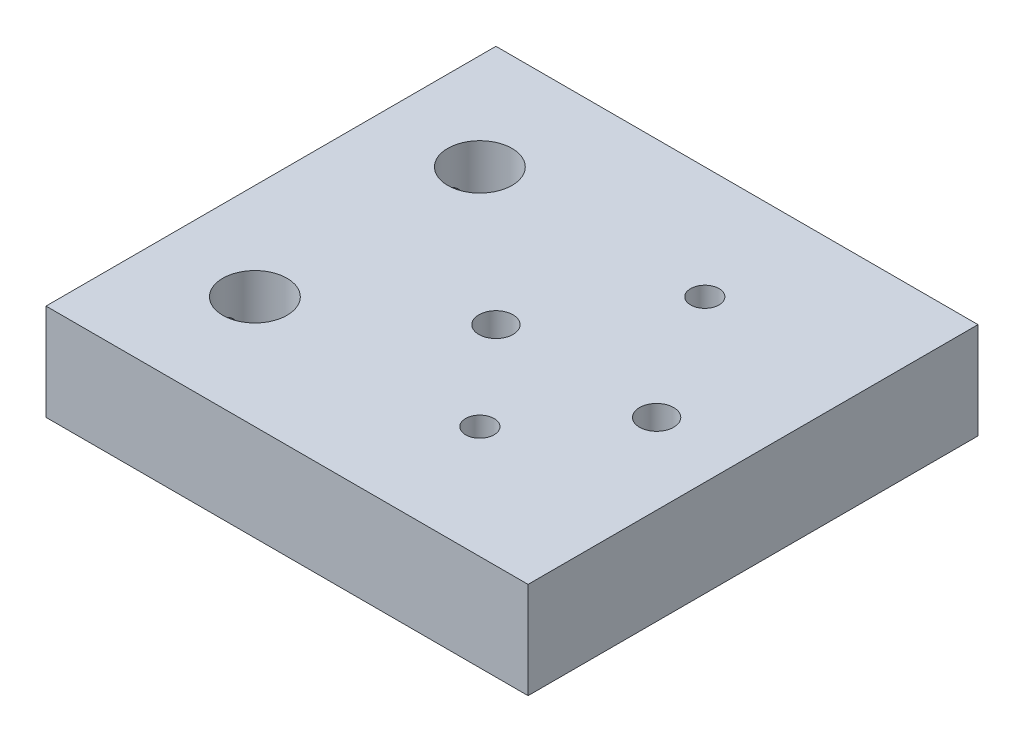
ISO-10303-21;
HEADER;
FILE_DESCRIPTION(('STEP AP214'),'2;1');
FILE_NAME('part.step','',(''),(''),'','','');
FILE_SCHEMA(('AUTOMOTIVE_DESIGN { 1 0 10303 214 1 1 1 1 }'));
ENDSEC;
DATA;
#1=APPLICATION_CONTEXT('core data for automotive mechanical design processes');
#2=APPLICATION_PROTOCOL_DEFINITION('international standard','automotive_design',2000,#1);
#3=PRODUCT_CONTEXT('',#1,'mechanical');
#4=PRODUCT('Part','Part','',(#3));
#5=PRODUCT_RELATED_PRODUCT_CATEGORY('part','',(#4));
#6=PRODUCT_DEFINITION_FORMATION('','',#4);
#7=PRODUCT_DEFINITION_CONTEXT('part definition',#1,'design');
#8=PRODUCT_DEFINITION('design','',#6,#7);
#9=PRODUCT_DEFINITION_SHAPE('','',#8);
#10=(LENGTH_UNIT() NAMED_UNIT(*) SI_UNIT(.MILLI.,.METRE.));
#11=(NAMED_UNIT(*) PLANE_ANGLE_UNIT() SI_UNIT($,.RADIAN.));
#12=(NAMED_UNIT(*) SI_UNIT($,.STERADIAN.) SOLID_ANGLE_UNIT());
#13=UNCERTAINTY_MEASURE_WITH_UNIT(LENGTH_MEASURE(1.E-05),#10,'distance_accuracy_value','');
#14=(GEOMETRIC_REPRESENTATION_CONTEXT(3) GLOBAL_UNCERTAINTY_ASSIGNED_CONTEXT((#13)) GLOBAL_UNIT_ASSIGNED_CONTEXT((#10,
#11,#12)) REPRESENTATION_CONTEXT('',''));
#15=CARTESIAN_POINT('',(0.,0.,0.));
#16=DIRECTION('',(0.,0.,1.));
#17=DIRECTION('',(1.,0.,0.));
#18=AXIS2_PLACEMENT_3D('',#15,#16,#17);
#19=CARTESIAN_POINT('',(0.,9.525,0.));
#20=DIRECTION('',(0.,-1.,0.));
#21=DIRECTION('',(0.,0.,-1.));
#22=AXIS2_PLACEMENT_3D('',#19,#20,#21);
#23=PLANE('',#22);
#24=CARTESIAN_POINT('',(0.,9.525,3.175));
#25=DIRECTION('',(0.,1.,0.));
#26=DIRECTION('',(0.,0.,1.));
#27=AXIS2_PLACEMENT_3D('',#24,#25,#26);
#28=CIRCLE('',#27,3.3782);
#29=CARTESIAN_POINT('',(0.,9.525,6.5532));
#30=VERTEX_POINT('',#29);
#31=EDGE_CURVE('E191',#30,#30,#28,.T.);
#32=ORIENTED_EDGE('',*,*,#31,.F.);
#33=EDGE_LOOP('',(#32));
#34=FACE_BOUND('',#33,.T.);
#35=CARTESIAN_POINT('',(15.875,9.525,-22.225));
#36=DIRECTION('',(0.,1.,0.));
#37=DIRECTION('',(0.,0.,1.));
#38=AXIS2_PLACEMENT_3D('',#35,#36,#37);
#39=CIRCLE('',#38,2.8067);
#40=CARTESIAN_POINT('',(15.875,9.525,-19.4183));
#41=VERTEX_POINT('',#40);
#42=EDGE_CURVE('E164',#41,#41,#39,.T.);
#43=ORIENTED_EDGE('',*,*,#42,.F.);
#44=EDGE_LOOP('',(#43));
#45=FACE_BOUND('',#44,.T.);
#46=CARTESIAN_POINT('',(15.875,9.525,22.225));
#47=DIRECTION('',(0.,1.,0.));
#48=DIRECTION('',(0.,0.,1.));
#49=AXIS2_PLACEMENT_3D('',#46,#47,#48);
#50=CIRCLE('',#49,2.8067);
#51=CARTESIAN_POINT('',(15.875,9.525,25.0317));
#52=VERTEX_POINT('',#51);
#53=EDGE_CURVE('E429',#52,#52,#50,.T.);
#54=ORIENTED_EDGE('',*,*,#53,.F.);
#55=EDGE_LOOP('',(#54));
#56=FACE_BOUND('',#55,.T.);
#57=CARTESIAN_POINT('',(-28.575,9.525,-22.225));
#58=DIRECTION('',(0.,1.,0.));
#59=DIRECTION('',(0.,0.,1.));
#60=AXIS2_PLACEMENT_3D('',#57,#58,#59);
#61=CIRCLE('',#60,6.35);
#62=CARTESIAN_POINT('',(-28.575,9.525,-15.875));
#63=VERTEX_POINT('',#62);
#64=EDGE_CURVE('E217',#63,#63,#61,.T.);
#65=ORIENTED_EDGE('',*,*,#64,.F.);
#66=EDGE_LOOP('',(#65));
#67=FACE_BOUND('',#66,.T.);
#68=CARTESIAN_POINT('',(-28.575,9.525,22.225));
#69=DIRECTION('',(0.,1.,0.));
#70=DIRECTION('',(0.,0.,1.));
#71=AXIS2_PLACEMENT_3D('',#68,#69,#70);
#72=CIRCLE('',#71,6.35);
#73=CARTESIAN_POINT('',(-28.575,9.525,28.575));
#74=VERTEX_POINT('',#73);
#75=EDGE_CURVE('E216',#74,#74,#72,.T.);
#76=ORIENTED_EDGE('',*,*,#75,.F.);
#77=EDGE_LOOP('',(#76));
#78=FACE_BOUND('',#77,.T.);
#79=DIRECTION('',(0.,0.,-1.));
#80=VECTOR('',#79,1.);
#81=CARTESIAN_POINT('',(-47.625,9.525,44.45));
#82=LINE('',#81,#80);
#83=CARTESIAN_POINT('',(-47.625,9.525,44.45));
#84=VERTEX_POINT('',#83);
#85=CARTESIAN_POINT('',(-47.625,9.525,-44.45));
#86=VERTEX_POINT('',#85);
#87=EDGE_CURVE('E115',#84,#86,#82,.T.);
#88=ORIENTED_EDGE('',*,*,#87,.F.);
#89=DIRECTION('',(1.,0.,0.));
#90=VECTOR('',#89,1.);
#91=CARTESIAN_POINT('',(-47.625,9.525,44.45));
#92=LINE('',#91,#90);
#93=CARTESIAN_POINT('',(47.625,9.525,44.45));
#94=VERTEX_POINT('',#93);
#95=EDGE_CURVE('E102',#84,#94,#92,.T.);
#96=ORIENTED_EDGE('',*,*,#95,.T.);
#97=DIRECTION('',(0.,0.,-1.));
#98=VECTOR('',#97,1.);
#99=CARTESIAN_POINT('',(47.625,9.525,44.45));
#100=LINE('',#99,#98);
#101=CARTESIAN_POINT('',(47.625,9.525,-44.45));
#102=VERTEX_POINT('',#101);
#103=EDGE_CURVE('E97',#94,#102,#100,.T.);
#104=ORIENTED_EDGE('',*,*,#103,.T.);
#105=DIRECTION('',(1.,0.,0.));
#106=VECTOR('',#105,1.);
#107=CARTESIAN_POINT('',(-47.625,9.525,-44.45));
#108=LINE('',#107,#106);
#109=EDGE_CURVE('E101',#86,#102,#108,.T.);
#110=ORIENTED_EDGE('',*,*,#109,.F.);
#111=EDGE_LOOP('',(#88,#96,#104,#110));
#112=FACE_BOUND('',#111,.T.);
#113=CARTESIAN_POINT('',(31.75,9.525,3.175));
#114=DIRECTION('',(0.,1.,0.));
#115=DIRECTION('',(0.,0.,1.));
#116=AXIS2_PLACEMENT_3D('',#113,#114,#115);
#117=CIRCLE('',#116,3.3782);
#118=CARTESIAN_POINT('',(31.75,9.525,6.5532));
#119=VERTEX_POINT('',#118);
#120=EDGE_CURVE('E200',#119,#119,#117,.T.);
#121=ORIENTED_EDGE('',*,*,#120,.F.);
#122=EDGE_LOOP('',(#121));
#123=FACE_BOUND('',#122,.T.);
#124=ADVANCED_FACE('F50',(#34,#45,#56,#67,#78,#112,#123),#23,.F.);
#125=CARTESIAN_POINT('',(-47.625,9.525,44.45));
#126=DIRECTION('',(-1.,0.,0.));
#127=DIRECTION('',(0.,0.,1.));
#128=AXIS2_PLACEMENT_3D('',#125,#126,#127);
#129=PLANE('',#128);
#130=CARTESIAN_POINT('',(-47.625,0.,-22.225));
#131=DIRECTION('',(-1.,0.,0.));
#132=DIRECTION('',(0.,0.,1.));
#133=AXIS2_PLACEMENT_3D('',#130,#131,#132);
#134=CIRCLE('',#133,2.55269999999999);
#135=CARTESIAN_POINT('',(-47.625,0.,-19.6723));
#136=VERTEX_POINT('',#135);
#137=EDGE_CURVE('E152',#136,#136,#134,.T.);
#138=ORIENTED_EDGE('',*,*,#137,.F.);
#139=EDGE_LOOP('',(#138));
#140=FACE_BOUND('',#139,.T.);
#141=CARTESIAN_POINT('',(-47.625,0.,22.225));
#142=DIRECTION('',(-1.,0.,0.));
#143=DIRECTION('',(0.,0.,1.));
#144=AXIS2_PLACEMENT_3D('',#141,#142,#143);
#145=CIRCLE('',#144,2.55269999999999);
#146=CARTESIAN_POINT('',(-47.625,0.,24.7777));
#147=VERTEX_POINT('',#146);
#148=EDGE_CURVE('E155',#147,#147,#145,.T.);
#149=ORIENTED_EDGE('',*,*,#148,.F.);
#150=EDGE_LOOP('',(#149));
#151=FACE_BOUND('',#150,.T.);
#152=DIRECTION('',(0.,0.,-1.));
#153=VECTOR('',#152,1.);
#154=CARTESIAN_POINT('',(-47.625,-9.525,44.45));
#155=LINE('',#154,#153);
#156=CARTESIAN_POINT('',(-47.625,-9.525,44.45));
#157=VERTEX_POINT('',#156);
#158=CARTESIAN_POINT('',(-47.625,-9.525,-44.45));
#159=VERTEX_POINT('',#158);
#160=EDGE_CURVE('E123',#157,#159,#155,.T.);
#161=ORIENTED_EDGE('',*,*,#160,.F.);
#162=DIRECTION('',(0.,-1.,0.));
#163=VECTOR('',#162,1.);
#164=CARTESIAN_POINT('',(-47.625,9.525,44.45));
#165=LINE('',#164,#163);
#166=EDGE_CURVE('E12',#84,#157,#165,.T.);
#167=ORIENTED_EDGE('',*,*,#166,.F.);
#168=ORIENTED_EDGE('',*,*,#87,.T.);
#169=DIRECTION('',(0.,-1.,0.));
#170=VECTOR('',#169,1.);
#171=CARTESIAN_POINT('',(-47.625,9.525,-44.45));
#172=LINE('',#171,#170);
#173=EDGE_CURVE('E54',#86,#159,#172,.T.);
#174=ORIENTED_EDGE('',*,*,#173,.T.);
#175=EDGE_LOOP('',(#161,#167,#168,#174));
#176=FACE_BOUND('',#175,.T.);
#177=ADVANCED_FACE('F52',(#140,#151,#176),#129,.T.);
#178=CARTESIAN_POINT('',(-47.625,9.525,44.45));
#179=DIRECTION('',(0.,0.,-1.));
#180=DIRECTION('',(-1.,0.,0.));
#181=AXIS2_PLACEMENT_3D('',#178,#179,#180);
#182=PLANE('',#181);
#183=DIRECTION('',(1.,0.,0.));
#184=VECTOR('',#183,1.);
#185=CARTESIAN_POINT('',(-47.625,-9.525,44.45));
#186=LINE('',#185,#184);
#187=CARTESIAN_POINT('',(47.625,-9.525,44.45));
#188=VERTEX_POINT('',#187);
#189=EDGE_CURVE('E85',#157,#188,#186,.T.);
#190=ORIENTED_EDGE('',*,*,#189,.T.);
#191=DIRECTION('',(0.,-1.,0.));
#192=VECTOR('',#191,1.);
#193=CARTESIAN_POINT('',(47.625,9.525,44.45));
#194=LINE('',#193,#192);
#195=EDGE_CURVE('E61',#94,#188,#194,.T.);
#196=ORIENTED_EDGE('',*,*,#195,.F.);
#197=ORIENTED_EDGE('',*,*,#95,.F.);
#198=ORIENTED_EDGE('',*,*,#166,.T.);
#199=EDGE_LOOP('',(#190,#196,#197,#198));
#200=FACE_BOUND('',#199,.T.);
#201=ADVANCED_FACE('F140',(#200),#182,.F.);
#202=CARTESIAN_POINT('',(47.625,9.525,44.45));
#203=DIRECTION('',(-1.,0.,0.));
#204=DIRECTION('',(0.,0.,1.));
#205=AXIS2_PLACEMENT_3D('',#202,#203,#204);
#206=PLANE('',#205);
#207=DIRECTION('',(0.,0.,-1.));
#208=VECTOR('',#207,1.);
#209=CARTESIAN_POINT('',(47.625,-9.525,44.45));
#210=LINE('',#209,#208);
#211=CARTESIAN_POINT('',(47.625,-9.525,-44.45));
#212=VERTEX_POINT('',#211);
#213=EDGE_CURVE('E110',#188,#212,#210,.T.);
#214=ORIENTED_EDGE('',*,*,#213,.T.);
#215=DIRECTION('',(0.,-1.,0.));
#216=VECTOR('',#215,1.);
#217=CARTESIAN_POINT('',(47.625,9.525,-44.45));
#218=LINE('',#217,#216);
#219=EDGE_CURVE('E107',#102,#212,#218,.T.);
#220=ORIENTED_EDGE('',*,*,#219,.F.);
#221=ORIENTED_EDGE('',*,*,#103,.F.);
#222=ORIENTED_EDGE('',*,*,#195,.T.);
#223=EDGE_LOOP('',(#214,#220,#221,#222));
#224=FACE_BOUND('',#223,.T.);
#225=ADVANCED_FACE('F108',(#224),#206,.F.);
#226=CARTESIAN_POINT('',(-47.625,9.525,-44.45));
#227=DIRECTION('',(0.,0.,-1.));
#228=DIRECTION('',(-1.,0.,0.));
#229=AXIS2_PLACEMENT_3D('',#226,#227,#228);
#230=PLANE('',#229);
#231=DIRECTION('',(1.,0.,0.));
#232=VECTOR('',#231,1.);
#233=CARTESIAN_POINT('',(-47.625,-9.525,-44.45));
#234=LINE('',#233,#232);
#235=EDGE_CURVE('E127',#159,#212,#234,.T.);
#236=ORIENTED_EDGE('',*,*,#235,.F.);
#237=ORIENTED_EDGE('',*,*,#173,.F.);
#238=ORIENTED_EDGE('',*,*,#109,.T.);
#239=ORIENTED_EDGE('',*,*,#219,.T.);
#240=EDGE_LOOP('',(#236,#237,#238,#239));
#241=FACE_BOUND('',#240,.T.);
#242=ADVANCED_FACE('F113',(#241),#230,.T.);
#243=CARTESIAN_POINT('',(0.,-9.525,0.));
#244=DIRECTION('',(0.,-1.,0.));
#245=DIRECTION('',(0.,0.,-1.));
#246=AXIS2_PLACEMENT_3D('',#243,#244,#245);
#247=PLANE('',#246);
#248=CARTESIAN_POINT('',(0.,-9.525,3.175));
#249=DIRECTION('',(0.,-1.,0.));
#250=DIRECTION('',(0.,0.,-1.));
#251=AXIS2_PLACEMENT_3D('',#248,#249,#250);
#252=CIRCLE('',#251,3.3782);
#253=CARTESIAN_POINT('',(0.,-9.525,-0.203199999999996));
#254=VERTEX_POINT('',#253);
#255=EDGE_CURVE('E195',#254,#254,#252,.T.);
#256=ORIENTED_EDGE('',*,*,#255,.F.);
#257=EDGE_LOOP('',(#256));
#258=FACE_BOUND('',#257,.T.);
#259=CARTESIAN_POINT('',(31.75,-9.525,3.175));
#260=DIRECTION('',(0.,-1.,0.));
#261=DIRECTION('',(0.,0.,-1.));
#262=AXIS2_PLACEMENT_3D('',#259,#260,#261);
#263=CIRCLE('',#262,3.3782);
#264=CARTESIAN_POINT('',(31.75,-9.525,-0.203200000000001));
#265=VERTEX_POINT('',#264);
#266=EDGE_CURVE('E205',#265,#265,#263,.T.);
#267=ORIENTED_EDGE('',*,*,#266,.F.);
#268=EDGE_LOOP('',(#267));
#269=FACE_BOUND('',#268,.T.);
#270=CARTESIAN_POINT('',(15.875,-9.525,-22.225));
#271=DIRECTION('',(0.,1.,0.));
#272=DIRECTION('',(0.,0.,1.));
#273=AXIS2_PLACEMENT_3D('',#270,#271,#272);
#274=CIRCLE('',#273,2.8067);
#275=CARTESIAN_POINT('',(15.875,-9.525,-19.4183));
#276=VERTEX_POINT('',#275);
#277=EDGE_CURVE('E416',#276,#276,#274,.T.);
#278=ORIENTED_EDGE('',*,*,#277,.T.);
#279=EDGE_LOOP('',(#278));
#280=FACE_BOUND('',#279,.T.);
#281=CARTESIAN_POINT('',(15.875,-9.525,22.225));
#282=DIRECTION('',(0.,1.,0.));
#283=DIRECTION('',(0.,0.,1.));
#284=AXIS2_PLACEMENT_3D('',#281,#282,#283);
#285=CIRCLE('',#284,2.8067);
#286=CARTESIAN_POINT('',(15.875,-9.525,25.0317));
#287=VERTEX_POINT('',#286);
#288=EDGE_CURVE('E420',#287,#287,#285,.T.);
#289=ORIENTED_EDGE('',*,*,#288,.T.);
#290=EDGE_LOOP('',(#289));
#291=FACE_BOUND('',#290,.T.);
#292=CARTESIAN_POINT('',(-28.575,-9.525,-22.225));
#293=DIRECTION('',(0.,1.,0.));
#294=DIRECTION('',(0.,0.,1.));
#295=AXIS2_PLACEMENT_3D('',#292,#293,#294);
#296=CIRCLE('',#295,6.35);
#297=CARTESIAN_POINT('',(-28.575,-9.525,-15.875));
#298=VERTEX_POINT('',#297);
#299=EDGE_CURVE('E212',#298,#298,#296,.T.);
#300=ORIENTED_EDGE('',*,*,#299,.T.);
#301=EDGE_LOOP('',(#300));
#302=FACE_BOUND('',#301,.T.);
#303=CARTESIAN_POINT('',(-28.575,-9.525,22.225));
#304=DIRECTION('',(0.,1.,0.));
#305=DIRECTION('',(0.,0.,1.));
#306=AXIS2_PLACEMENT_3D('',#303,#304,#305);
#307=CIRCLE('',#306,6.35);
#308=CARTESIAN_POINT('',(-28.575,-9.525,28.575));
#309=VERTEX_POINT('',#308);
#310=EDGE_CURVE('E128',#309,#309,#307,.T.);
#311=ORIENTED_EDGE('',*,*,#310,.T.);
#312=EDGE_LOOP('',(#311));
#313=FACE_BOUND('',#312,.T.);
#314=ORIENTED_EDGE('',*,*,#160,.T.);
#315=ORIENTED_EDGE('',*,*,#235,.T.);
#316=ORIENTED_EDGE('',*,*,#213,.F.);
#317=ORIENTED_EDGE('',*,*,#189,.F.);
#318=EDGE_LOOP('',(#314,#315,#316,#317));
#319=FACE_BOUND('',#318,.T.);
#320=ADVANCED_FACE('F137',(#258,#269,#280,#291,#302,#313,#319),#247,.T.);
#321=CARTESIAN_POINT('',(-28.575,9.525,22.225));
#322=DIRECTION('',(0.,1.,0.));
#323=DIRECTION('',(0.,0.,1.));
#324=AXIS2_PLACEMENT_3D('',#321,#322,#323);
#325=CYLINDRICAL_SURFACE('',#324,6.35);
#326=CARTESIAN_POINT('',(-34.3893118861994,0.,24.7777));
#327=CARTESIAN_POINT('',(-34.3893207840257,0.136644230876427,24.7776905630964));
#328=CARTESIAN_POINT('',(-34.3941970013208,0.27351650105487,24.7666613403213));
#329=CARTESIAN_POINT('',(-34.4130821156723,0.543347118865531,24.7229659691094));
#330=CARTESIAN_POINT('',(-34.4271165777372,0.67629341812184,24.6902392485546));
#331=CARTESIAN_POINT('',(-34.4624560429728,0.933885027584984,24.6045966475668));
#332=CARTESIAN_POINT('',(-34.4837327680991,1.05856040334485,24.5517591977816));
#333=CARTESIAN_POINT('',(-34.5311177412081,1.29723813026774,24.4276251334853));
#334=CARTESIAN_POINT('',(-34.557224612197,1.41124350935437,24.3563337775678));
#335=CARTESIAN_POINT('',(-34.6130193835833,1.63201228934419,24.192904215303));
#336=CARTESIAN_POINT('',(-34.642823266555,1.7380827283516,24.0998690687955));
#337=CARTESIAN_POINT('',(-34.7016968325318,1.9336239073497,23.8974791727677));
#338=CARTESIAN_POINT('',(-34.7307662402203,2.0230885001369,23.7881184067011));
#339=CARTESIAN_POINT('',(-34.7862885310745,2.186325088422,23.5508220688651));
#340=CARTESIAN_POINT('',(-34.8125908119817,2.25932887163979,23.4223196171568));
#341=CARTESIAN_POINT('',(-34.8582085853736,2.38238704946134,23.1536113524334));
#342=CARTESIAN_POINT('',(-34.8775269758428,2.432450965338,23.0134104235268));
#343=CARTESIAN_POINT('',(-34.9061795182531,2.50573207200511,22.7325487875516));
#344=CARTESIAN_POINT('',(-34.9159552413327,2.53014109667188,22.5922450021179));
#345=CARTESIAN_POINT('',(-34.9260179626861,2.55525888401578,22.3092150844863));
#346=CARTESIAN_POINT('',(-34.9263085306665,2.55597656285337,22.1664898838139));
#347=CARTESIAN_POINT('',(-34.9176358664989,2.53434125959379,21.8912899689385));
#348=CARTESIAN_POINT('',(-34.9091966052856,2.51329461177912,21.7586930361748));
#349=CARTESIAN_POINT('',(-34.8847203736382,2.45095213147042,21.4990974885373));
#350=CARTESIAN_POINT('',(-34.8686828456744,2.40965481305736,21.3720992852228));
#351=CARTESIAN_POINT('',(-34.8302704613184,2.30747763537692,21.1250118630568));
#352=CARTESIAN_POINT('',(-34.8078035633657,2.24631148147759,21.0050559352083));
#353=CARTESIAN_POINT('',(-34.7587583761332,2.10640256293183,20.7768005871031));
#354=CARTESIAN_POINT('',(-34.7321786728798,2.02765374926456,20.6685051975113));
#355=CARTESIAN_POINT('',(-34.6755238885334,1.84873760003835,20.459029316441));
#356=CARTESIAN_POINT('',(-34.6453338981824,1.74749711332906,20.3587951261971));
#357=CARTESIAN_POINT('',(-34.5862144481345,1.52953196658914,20.1763371143068));
#358=CARTESIAN_POINT('',(-34.5572854120486,1.4128021554562,20.0941193083794));
#359=CARTESIAN_POINT('',(-34.5031771467625,1.16289923503646,19.9478326383591));
#360=CARTESIAN_POINT('',(-34.478129774289,1.02934961722011,19.8843540981825));
#361=CARTESIAN_POINT('',(-34.4361697310355,0.752181214385129,19.7811650420042));
#362=CARTESIAN_POINT('',(-34.4192517153212,0.608569116678133,19.7414389049313));
#363=CARTESIAN_POINT('',(-34.3967665888749,0.324797667253,19.689196661302));
#364=CARTESIAN_POINT('',(-34.3905648707688,0.184969938387648,19.6751561521221));
#365=CARTESIAN_POINT('',(-34.3884057765735,-0.0951507257144279,19.6702340020796));
#366=CARTESIAN_POINT('',(-34.3924452446981,-0.235443504342815,19.6793452270917));
#367=CARTESIAN_POINT('',(-34.4096615591369,-0.503988494280952,19.7190795541411));
#368=CARTESIAN_POINT('',(-34.4222970452956,-0.632468074375072,19.7484294778695));
#369=CARTESIAN_POINT('',(-34.4546077561975,-0.882591453561504,19.8261522025503));
#370=CARTESIAN_POINT('',(-34.4742845519057,-1.00423372018862,19.8745292488245));
#371=CARTESIAN_POINT('',(-34.5194420965017,-1.24276288922197,19.9911339440295));
#372=CARTESIAN_POINT('',(-34.5451268114242,-1.35925356352892,20.0600906623615));
#373=CARTESIAN_POINT('',(-34.5990976609546,-1.57954378782647,20.2151543389378));
#374=CARTESIAN_POINT('',(-34.6273848603182,-1.68333810252842,20.3012683336927));
#375=CARTESIAN_POINT('',(-34.6859263320401,-1.883354673963,20.4957997457735));
#376=CARTESIAN_POINT('',(-34.7161695949968,-1.97843104775435,20.6054031416439));
#377=CARTESIAN_POINT('',(-34.7732294076456,-2.14902299895438,20.8397287660589));
#378=CARTESIAN_POINT('',(-34.8000458043801,-2.22453770338461,20.964451668977));
#379=CARTESIAN_POINT('',(-34.8473252152824,-2.35360510396384,21.2259648309163));
#380=CARTESIAN_POINT('',(-34.8677878008412,-2.4071563185998,21.3627559032212));
#381=CARTESIAN_POINT('',(-34.8999889851881,-2.49012865946434,21.6444312072062));
#382=CARTESIAN_POINT('',(-34.9117323770651,-2.51956304404712,21.7893109452404));
#383=CARTESIAN_POINT('',(-34.9246556037835,-2.55188165583977,22.0727684644397));
#384=CARTESIAN_POINT('',(-34.9264796949869,-2.55638549081259,22.2111336104095));
#385=CARTESIAN_POINT('',(-34.9211041926017,-2.54300130971525,22.4865828019209));
#386=CARTESIAN_POINT('',(-34.9139059946001,-2.52511675672969,22.6236670422916));
#387=CARTESIAN_POINT('',(-34.8916190764052,-2.46862186925837,22.888265757511));
#388=CARTESIAN_POINT('',(-34.8767841357678,-2.43067712932522,23.0159454367188));
#389=CARTESIAN_POINT('',(-34.8408165654285,-2.3358411536055,23.2631014797232));
#390=CARTESIAN_POINT('',(-34.8196826993924,-2.27894619806969,23.3825762274107));
#391=CARTESIAN_POINT('',(-34.772022548106,-2.14498253941049,23.6157561598021));
#392=CARTESIAN_POINT('',(-34.7452986304533,-2.0671308352048,23.7289702467746));
#393=CARTESIAN_POINT('',(-34.6896730238228,-1.89464120544197,23.9411961260617));
#394=CARTESIAN_POINT('',(-34.6607706017804,-1.79999761479716,24.0402031048628));
#395=CARTESIAN_POINT('',(-34.6017956826071,-1.5896049926822,24.2276201667877));
#396=CARTESIAN_POINT('',(-34.5717628982672,-1.47290679151446,24.3149817397396));
#397=CARTESIAN_POINT('',(-34.5158507864228,-1.2255612177529,24.4689979076082));
#398=CARTESIAN_POINT('',(-34.4899737076573,-1.09490635616421,24.5356413096205));
#399=CARTESIAN_POINT('',(-34.4459258880712,-0.824088699069507,24.6453807881967));
#400=CARTESIAN_POINT('',(-34.4276870508593,-0.684023428657366,24.6886859711665));
#401=CARTESIAN_POINT('',(-34.4078089022967,-0.46962244405582,24.7351984130573));
#402=CARTESIAN_POINT('',(-34.4024311286889,-0.397509797383133,24.747625217765));
#403=CARTESIAN_POINT('',(-34.3943370157444,-0.252349733966651,24.7662460065741));
#404=CARTESIAN_POINT('',(-34.391618692292,-0.179303055352564,24.772444637375));
#405=CARTESIAN_POINT('',(-34.3896339239602,-0.0707819266782834,24.7769653469489));
#406=CARTESIAN_POINT('',(-34.3893095811571,-0.0353986152456103,24.7777024446939));
#407=CARTESIAN_POINT('',(-34.3893118861994,0.,24.7777));
#408=B_SPLINE_CURVE_WITH_KNOTS('',3,(#326,#327,#328,#329,#330,#331,#332,#333,#334,#335,#336,
#337,#338,#339,#340,#341,#342,#343,#344,#345,#346,#347,#348,#349,#350,#351,#352,#353,#354,#355,
#356,#357,#358,#359,#360,#361,#362,#363,#364,#365,#366,#367,#368,#369,#370,#371,#372,#373,#374,
#375,#376,#377,#378,#379,#380,#381,#382,#383,#384,#385,#386,#387,#388,#389,#390,#391,#392,#393,
#394,#395,#396,#397,#398,#399,#400,#401,#402,#403,#404,#405,#406,#407),.UNSPECIFIED.,.T.,.F.,(4,
2,2,2,2,2,2,2,2,2,2,2,2,2,2,2,2,2,2,2,2,2,2,2,2,2,2,2,2,2,2,2,2,2,2,2,2,2,2,2,4),(0.,
0.409813027697708,0.820774960185181,1.23015032076318,1.63940915461153,2.07012276482946,
2.50099550133308,2.94905343801225,3.39692523783535,3.82292176393996,4.24875796581775,
4.65043934387802,5.05215020023797,5.45992720747977,5.86784472035728,6.30277962208961,
6.7378595292102,7.18545908352289,7.63276394355576,8.05253470753319,8.47217613631551,
8.86757432894773,9.26306079271197,9.67467552416571,10.0864594150721,10.5290226249512,
10.9716055816936,11.414218387273,11.8565877005578,12.2698481825711,12.6830447484512,
13.0833204379465,13.4836747441475,13.9017901458122,14.3200468764535,14.7644347870622,
15.2090623608209,15.649636965436,15.8695010996571,16.0892010761552,16.1953659218795),.UNSPECIFIED.);
#409=CARTESIAN_POINT('',(-34.3893118861994,0.,24.7777));
#410=VERTEX_POINT('',#409);
#411=EDGE_CURVE('E158',#410,#410,#408,.T.);
#412=ORIENTED_EDGE('',*,*,#411,.T.);
#413=EDGE_LOOP('',(#412));
#414=FACE_BOUND('',#413,.T.);
#415=ORIENTED_EDGE('',*,*,#310,.F.);
#416=EDGE_LOOP('',(#415));
#417=FACE_BOUND('',#416,.T.);
#418=ORIENTED_EDGE('',*,*,#75,.T.);
#419=EDGE_LOOP('',(#418));
#420=FACE_BOUND('',#419,.T.);
#421=ADVANCED_FACE('F229',(#414,#417,#420),#325,.F.);
#422=CARTESIAN_POINT('',(-28.575,9.525,-22.225));
#423=DIRECTION('',(0.,1.,0.));
#424=DIRECTION('',(0.,0.,1.));
#425=AXIS2_PLACEMENT_3D('',#422,#423,#424);
#426=CYLINDRICAL_SURFACE('',#425,6.35);
#427=CARTESIAN_POINT('',(-34.3893118861994,0.,-19.6723));
#428=CARTESIAN_POINT('',(-34.3893207840257,0.136644230876427,-19.6723094369036));
#429=CARTESIAN_POINT('',(-34.3941970013208,0.273516501054871,-19.6833386596787));
#430=CARTESIAN_POINT('',(-34.4130821156723,0.543347118865531,-19.7270340308906));
#431=CARTESIAN_POINT('',(-34.4271165777372,0.676293418121839,-19.7597607514454));
#432=CARTESIAN_POINT('',(-34.4624560429728,0.933885027584983,-19.8454033524332));
#433=CARTESIAN_POINT('',(-34.4837327680991,1.05856040334485,-19.8982408022184));
#434=CARTESIAN_POINT('',(-34.5311177412081,1.29723813026774,-20.0223748665147));
#435=CARTESIAN_POINT('',(-34.557224612197,1.41124350935437,-20.0936662224322));
#436=CARTESIAN_POINT('',(-34.6130193835833,1.63201228934419,-20.257095784697));
#437=CARTESIAN_POINT('',(-34.642823266555,1.73808272835159,-20.3501309312045));
#438=CARTESIAN_POINT('',(-34.7016968325318,1.9336239073497,-20.5525208272323));
#439=CARTESIAN_POINT('',(-34.7307662402203,2.0230885001369,-20.6618815932989));
#440=CARTESIAN_POINT('',(-34.7862885310745,2.186325088422,-20.8991779311349));
#441=CARTESIAN_POINT('',(-34.8125908119817,2.25932887163979,-21.0276803828432));
#442=CARTESIAN_POINT('',(-34.8582085853736,2.38238704946134,-21.2963886475666));
#443=CARTESIAN_POINT('',(-34.8775269758428,2.432450965338,-21.4365895764732));
#444=CARTESIAN_POINT('',(-34.9061795182531,2.50573207200511,-21.7174512124484));
#445=CARTESIAN_POINT('',(-34.9159552413327,2.53014109667188,-21.8577549978821));
#446=CARTESIAN_POINT('',(-34.9260179626861,2.55525888401578,-22.1407849155137));
#447=CARTESIAN_POINT('',(-34.9263085306665,2.55597656285337,-22.2835101161861));
#448=CARTESIAN_POINT('',(-34.9176358664989,2.53434125959379,-22.5587100310615));
#449=CARTESIAN_POINT('',(-34.9091966052856,2.51329461177912,-22.6913069638252));
#450=CARTESIAN_POINT('',(-34.8847203736382,2.45095213147042,-22.9509025114628));
#451=CARTESIAN_POINT('',(-34.8686828456744,2.40965481305736,-23.0779007147772));
#452=CARTESIAN_POINT('',(-34.8302704613184,2.30747763537692,-23.3249881369432));
#453=CARTESIAN_POINT('',(-34.8078035633657,2.24631148147759,-23.4449440647917));
#454=CARTESIAN_POINT('',(-34.7587583761332,2.10640256293183,-23.6731994128969));
#455=CARTESIAN_POINT('',(-34.7321786728798,2.02765374926456,-23.7814948024887));
#456=CARTESIAN_POINT('',(-34.6755238885334,1.84873760003835,-23.990970683559));
#457=CARTESIAN_POINT('',(-34.6453338981824,1.74749711332906,-24.0912048738029));
#458=CARTESIAN_POINT('',(-34.5862144481345,1.52953196658914,-24.2736628856932));
#459=CARTESIAN_POINT('',(-34.5572854120486,1.4128021554562,-24.3558806916206));
#460=CARTESIAN_POINT('',(-34.5031771467625,1.16289923503646,-24.5021673616409));
#461=CARTESIAN_POINT('',(-34.478129774289,1.02934961722011,-24.5656459018175));
#462=CARTESIAN_POINT('',(-34.4361697310355,0.752181214385129,-24.6688349579958));
#463=CARTESIAN_POINT('',(-34.4192517153212,0.608569116678133,-24.7085610950687));
#464=CARTESIAN_POINT('',(-34.3967665888749,0.324797667253,-24.760803338698));
#465=CARTESIAN_POINT('',(-34.3905648707688,0.184969938387648,-24.7748438478779));
#466=CARTESIAN_POINT('',(-34.3884057765735,-0.0951507257144279,-24.7797659979204));
#467=CARTESIAN_POINT('',(-34.3924452446981,-0.235443504342815,-24.7706547729083));
#468=CARTESIAN_POINT('',(-34.4096615591369,-0.503988494280952,-24.7309204458589));
#469=CARTESIAN_POINT('',(-34.4222970452956,-0.632468074375072,-24.7015705221305));
#470=CARTESIAN_POINT('',(-34.4546077561975,-0.882591453561504,-24.6238477974497));
#471=CARTESIAN_POINT('',(-34.4742845519057,-1.00423372018862,-24.5754707511755));
#472=CARTESIAN_POINT('',(-34.5194420965017,-1.24276288922196,-24.4588660559705));
#473=CARTESIAN_POINT('',(-34.5451268114242,-1.35925356352892,-24.3899093376385));
#474=CARTESIAN_POINT('',(-34.5990976609546,-1.57954378782647,-24.2348456610622));
#475=CARTESIAN_POINT('',(-34.6273848603182,-1.68333810252842,-24.1487316663073));
#476=CARTESIAN_POINT('',(-34.6859263320401,-1.883354673963,-23.9542002542265));
#477=CARTESIAN_POINT('',(-34.7161695949968,-1.97843104775435,-23.8445968583561));
#478=CARTESIAN_POINT('',(-34.7732294076456,-2.14902299895438,-23.6102712339411));
#479=CARTESIAN_POINT('',(-34.8000458043801,-2.22453770338461,-23.485548331023));
#480=CARTESIAN_POINT('',(-34.8473252152824,-2.35360510396384,-23.2240351690837));
#481=CARTESIAN_POINT('',(-34.8677878008412,-2.4071563185998,-23.0872440967788));
#482=CARTESIAN_POINT('',(-34.8999889851881,-2.49012865946434,-22.8055687927938));
#483=CARTESIAN_POINT('',(-34.9117323770651,-2.51956304404712,-22.6606890547596));
#484=CARTESIAN_POINT('',(-34.9246556037835,-2.55188165583977,-22.3772315355603));
#485=CARTESIAN_POINT('',(-34.9264796949869,-2.55638549081259,-22.2388663895905));
#486=CARTESIAN_POINT('',(-34.9211041926017,-2.54300130971525,-21.9634171980791));
#487=CARTESIAN_POINT('',(-34.9139059946001,-2.52511675672969,-21.8263329577084));
#488=CARTESIAN_POINT('',(-34.8916190764052,-2.46862186925837,-21.561734242489));
#489=CARTESIAN_POINT('',(-34.8767841357678,-2.43067712932522,-21.4340545632812));
#490=CARTESIAN_POINT('',(-34.8408165654285,-2.3358411536055,-21.1868985202768));
#491=CARTESIAN_POINT('',(-34.8196826993924,-2.27894619806969,-21.0674237725893));
#492=CARTESIAN_POINT('',(-34.772022548106,-2.14498253941049,-20.8342438401979));
#493=CARTESIAN_POINT('',(-34.7452986304533,-2.0671308352048,-20.7210297532254));
#494=CARTESIAN_POINT('',(-34.6896730238228,-1.89464120544197,-20.5088038739383));
#495=CARTESIAN_POINT('',(-34.6607706017804,-1.79999761479716,-20.4097968951373));
#496=CARTESIAN_POINT('',(-34.6017956826071,-1.5896049926822,-20.2223798332123));
#497=CARTESIAN_POINT('',(-34.5717628982672,-1.47290679151446,-20.1350182602604));
#498=CARTESIAN_POINT('',(-34.5158507864228,-1.2255612177529,-19.9810020923918));
#499=CARTESIAN_POINT('',(-34.4899737076573,-1.09490635616421,-19.9143586903795));
#500=CARTESIAN_POINT('',(-34.4459258880712,-0.824088699069507,-19.8046192118033));
#501=CARTESIAN_POINT('',(-34.4276870508593,-0.684023428657366,-19.7613140288335));
#502=CARTESIAN_POINT('',(-34.4078089022967,-0.469622444055819,-19.7148015869427));
#503=CARTESIAN_POINT('',(-34.4024311286889,-0.397509797383132,-19.702374782235));
#504=CARTESIAN_POINT('',(-34.3943370157444,-0.252349733966651,-19.6837539934259));
#505=CARTESIAN_POINT('',(-34.391618692292,-0.179303055352563,-19.677555362625));
#506=CARTESIAN_POINT('',(-34.3896339239602,-0.0707819266782834,-19.6730346530511));
#507=CARTESIAN_POINT('',(-34.3893095811571,-0.0353986152456103,-19.6722975553061));
#508=CARTESIAN_POINT('',(-34.3893118861994,0.,-19.6723));
#509=B_SPLINE_CURVE_WITH_KNOTS('',3,(#427,#428,#429,#430,#431,#432,#433,#434,#435,#436,#437,
#438,#439,#440,#441,#442,#443,#444,#445,#446,#447,#448,#449,#450,#451,#452,#453,#454,#455,#456,
#457,#458,#459,#460,#461,#462,#463,#464,#465,#466,#467,#468,#469,#470,#471,#472,#473,#474,#475,
#476,#477,#478,#479,#480,#481,#482,#483,#484,#485,#486,#487,#488,#489,#490,#491,#492,#493,#494,
#495,#496,#497,#498,#499,#500,#501,#502,#503,#504,#505,#506,#507,#508),.UNSPECIFIED.,.T.,.F.,(4,
2,2,2,2,2,2,2,2,2,2,2,2,2,2,2,2,2,2,2,2,2,2,2,2,2,2,2,2,2,2,2,2,2,2,2,2,2,2,2,4),(0.,
0.409813027697709,0.820774960185181,1.23015032076318,1.63940915461153,2.07012276482945,
2.50099550133308,2.94905343801226,3.39692523783535,3.82292176393996,4.24875796581775,
4.65043934387802,5.05215020023797,5.45992720747977,5.86784472035728,6.30277962208961,
6.73785952921021,7.1854590835229,7.63276394355576,8.05253470753319,8.47217613631551,
8.86757432894773,9.26306079271197,9.67467552416571,10.0864594150721,10.5290226249512,
10.9716055816936,11.414218387273,11.8565877005578,12.2698481825711,12.6830447484512,
13.0833204379465,13.4836747441475,13.9017901458122,14.3200468764535,14.7644347870622,
15.2090623608209,15.649636965436,15.8695010996571,16.0892010761552,16.1953659218795),.UNSPECIFIED.);
#510=CARTESIAN_POINT('',(-34.3893118861994,0.,-19.6723));
#511=VERTEX_POINT('',#510);
#512=EDGE_CURVE('E159',#511,#511,#509,.T.);
#513=ORIENTED_EDGE('',*,*,#512,.T.);
#514=EDGE_LOOP('',(#513));
#515=FACE_BOUND('',#514,.T.);
#516=ORIENTED_EDGE('',*,*,#299,.F.);
#517=EDGE_LOOP('',(#516));
#518=FACE_BOUND('',#517,.T.);
#519=ORIENTED_EDGE('',*,*,#64,.T.);
#520=EDGE_LOOP('',(#519));
#521=FACE_BOUND('',#520,.T.);
#522=ADVANCED_FACE('F232',(#515,#518,#521),#426,.F.);
#523=CARTESIAN_POINT('',(15.875,9.525,22.225));
#524=DIRECTION('',(0.,1.,0.));
#525=DIRECTION('',(0.,0.,1.));
#526=AXIS2_PLACEMENT_3D('',#523,#524,#525);
#527=CYLINDRICAL_SURFACE('',#526,2.8067);
#528=ORIENTED_EDGE('',*,*,#288,.F.);
#529=EDGE_LOOP('',(#528));
#530=FACE_BOUND('',#529,.T.);
#531=ORIENTED_EDGE('',*,*,#53,.T.);
#532=EDGE_LOOP('',(#531));
#533=FACE_BOUND('',#532,.T.);
#534=ADVANCED_FACE('F241',(#530,#533),#527,.F.);
#535=CARTESIAN_POINT('',(15.875,9.525,-22.225));
#536=DIRECTION('',(0.,1.,0.));
#537=DIRECTION('',(0.,0.,1.));
#538=AXIS2_PLACEMENT_3D('',#535,#536,#537);
#539=CYLINDRICAL_SURFACE('',#538,2.8067);
#540=ORIENTED_EDGE('',*,*,#277,.F.);
#541=EDGE_LOOP('',(#540));
#542=FACE_BOUND('',#541,.T.);
#543=ORIENTED_EDGE('',*,*,#42,.T.);
#544=EDGE_LOOP('',(#543));
#545=FACE_BOUND('',#544,.T.);
#546=ADVANCED_FACE('F276',(#542,#545),#539,.F.);
#547=CARTESIAN_POINT('',(-47.625,0.,22.225));
#548=DIRECTION('',(-1.,0.,0.));
#549=DIRECTION('',(0.,0.,1.));
#550=AXIS2_PLACEMENT_3D('',#547,#548,#549);
#551=CYLINDRICAL_SURFACE('',#550,2.55269999999999);
#552=ORIENTED_EDGE('',*,*,#411,.F.);
#553=EDGE_LOOP('',(#552));
#554=FACE_BOUND('',#553,.T.);
#555=ORIENTED_EDGE('',*,*,#148,.T.);
#556=EDGE_LOOP('',(#555));
#557=FACE_BOUND('',#556,.T.);
#558=ADVANCED_FACE('F284',(#554,#557),#551,.F.);
#559=CARTESIAN_POINT('',(-47.625,0.,-22.225));
#560=DIRECTION('',(-1.,0.,0.));
#561=DIRECTION('',(0.,0.,1.));
#562=AXIS2_PLACEMENT_3D('',#559,#560,#561);
#563=CYLINDRICAL_SURFACE('',#562,2.55269999999999);
#564=ORIENTED_EDGE('',*,*,#512,.F.);
#565=EDGE_LOOP('',(#564));
#566=FACE_BOUND('',#565,.T.);
#567=ORIENTED_EDGE('',*,*,#137,.T.);
#568=EDGE_LOOP('',(#567));
#569=FACE_BOUND('',#568,.T.);
#570=ADVANCED_FACE('F293',(#566,#569),#563,.F.);
#571=CARTESIAN_POINT('',(31.75,9.525,3.175));
#572=DIRECTION('',(0.,1.,0.));
#573=DIRECTION('',(0.,0.,1.));
#574=AXIS2_PLACEMENT_3D('',#571,#572,#573);
#575=CYLINDRICAL_SURFACE('',#574,3.3782);
#576=ORIENTED_EDGE('',*,*,#120,.T.);
#577=EDGE_LOOP('',(#576));
#578=FACE_BOUND('',#577,.T.);
#579=ORIENTED_EDGE('',*,*,#266,.T.);
#580=EDGE_LOOP('',(#579));
#581=FACE_BOUND('',#580,.T.);
#582=ADVANCED_FACE('F300',(#578,#581),#575,.F.);
#583=CARTESIAN_POINT('',(0.,9.525,3.175));
#584=DIRECTION('',(0.,1.,0.));
#585=DIRECTION('',(0.,0.,1.));
#586=AXIS2_PLACEMENT_3D('',#583,#584,#585);
#587=CYLINDRICAL_SURFACE('',#586,3.3782);
#588=ORIENTED_EDGE('',*,*,#31,.T.);
#589=EDGE_LOOP('',(#588));
#590=FACE_BOUND('',#589,.T.);
#591=ORIENTED_EDGE('',*,*,#255,.T.);
#592=EDGE_LOOP('',(#591));
#593=FACE_BOUND('',#592,.T.);
#594=ADVANCED_FACE('F307',(#590,#593),#587,.F.);
#595=CLOSED_SHELL('',(#124,#177,#201,#225,#242,#320,#421,#522,#534,#546,#558,#570,#582,#594));
#596=MANIFOLD_SOLID_BREP('B2',#595);
#597=ADVANCED_BREP_SHAPE_REPRESENTATION('',(#18,#596),#14);
#598=SHAPE_DEFINITION_REPRESENTATION(#9,#597);
ENDSEC;
END-ISO-10303-21;
